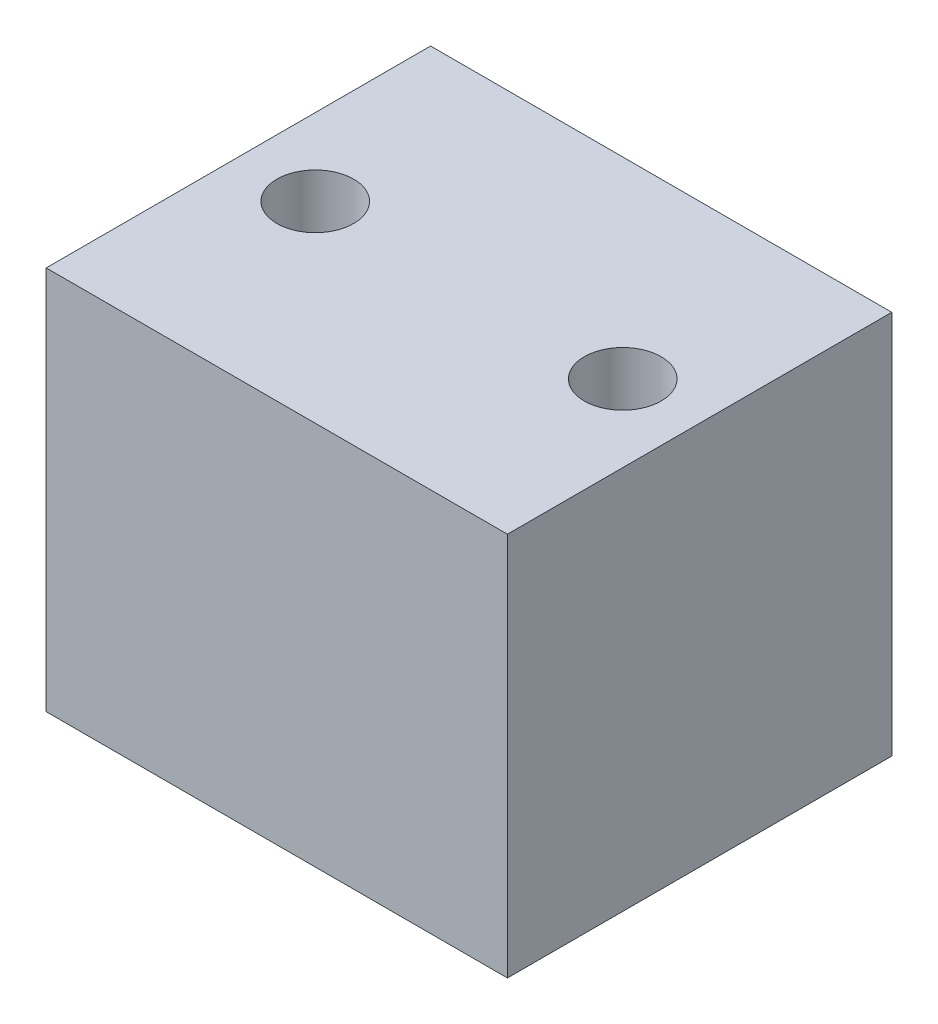
ISO-10303-21;
HEADER;
FILE_DESCRIPTION(('STEP AP214'),'2;1');
FILE_NAME('part.step','',(''),(''),'','','');
FILE_SCHEMA(('AUTOMOTIVE_DESIGN { 1 0 10303 214 1 1 1 1 }'));
ENDSEC;
DATA;
#1=APPLICATION_CONTEXT('core data for automotive mechanical design processes');
#2=APPLICATION_PROTOCOL_DEFINITION('international standard','automotive_design',2000,#1);
#3=PRODUCT_CONTEXT('',#1,'mechanical');
#4=PRODUCT('Part','Part','',(#3));
#5=PRODUCT_RELATED_PRODUCT_CATEGORY('part','',(#4));
#6=PRODUCT_DEFINITION_FORMATION('','',#4);
#7=PRODUCT_DEFINITION_CONTEXT('part definition',#1,'design');
#8=PRODUCT_DEFINITION('design','',#6,#7);
#9=PRODUCT_DEFINITION_SHAPE('','',#8);
#10=(LENGTH_UNIT() NAMED_UNIT(*) SI_UNIT(.MILLI.,.METRE.));
#11=(NAMED_UNIT(*) PLANE_ANGLE_UNIT() SI_UNIT($,.RADIAN.));
#12=(NAMED_UNIT(*) SI_UNIT($,.STERADIAN.) SOLID_ANGLE_UNIT());
#13=UNCERTAINTY_MEASURE_WITH_UNIT(LENGTH_MEASURE(1.E-05),#10,'distance_accuracy_value','');
#14=(GEOMETRIC_REPRESENTATION_CONTEXT(3) GLOBAL_UNCERTAINTY_ASSIGNED_CONTEXT((#13)) GLOBAL_UNIT_ASSIGNED_CONTEXT((#10,
#11,#12)) REPRESENTATION_CONTEXT('',''));
#15=CARTESIAN_POINT('',(0.,0.,0.));
#16=DIRECTION('',(0.,0.,1.));
#17=DIRECTION('',(1.,0.,0.));
#18=AXIS2_PLACEMENT_3D('',#15,#16,#17);
#19=CARTESIAN_POINT('',(15.,25.,0.));
#20=DIRECTION('',(1.,0.,0.));
#21=DIRECTION('',(0.,0.,-1.));
#22=AXIS2_PLACEMENT_3D('',#19,#20,#21);
#23=PLANE('',#22);
#24=DIRECTION('',(0.,0.,1.));
#25=VECTOR('',#24,1.);
#26=CARTESIAN_POINT('',(15.,0.,0.));
#27=LINE('',#26,#25);
#28=CARTESIAN_POINT('',(15.,0.,-12.5));
#29=VERTEX_POINT('',#28);
#30=CARTESIAN_POINT('',(15.,0.,12.5));
#31=VERTEX_POINT('',#30);
#32=EDGE_CURVE('E111',#29,#31,#27,.T.);
#33=ORIENTED_EDGE('',*,*,#32,.F.);
#34=DIRECTION('',(0.,-1.,0.));
#35=VECTOR('',#34,1.);
#36=CARTESIAN_POINT('',(15.,25.,-12.5));
#37=LINE('',#36,#35);
#38=CARTESIAN_POINT('',(15.,25.,-12.5));
#39=VERTEX_POINT('',#38);
#40=EDGE_CURVE('E11',#39,#29,#37,.T.);
#41=ORIENTED_EDGE('',*,*,#40,.F.);
#42=DIRECTION('',(0.,0.,1.));
#43=VECTOR('',#42,1.);
#44=CARTESIAN_POINT('',(15.,25.,0.));
#45=LINE('',#44,#43);
#46=CARTESIAN_POINT('',(15.,25.,12.5));
#47=VERTEX_POINT('',#46);
#48=EDGE_CURVE('E98',#39,#47,#45,.T.);
#49=ORIENTED_EDGE('',*,*,#48,.T.);
#50=DIRECTION('',(0.,-1.,0.));
#51=VECTOR('',#50,1.);
#52=CARTESIAN_POINT('',(15.,25.,12.5));
#53=LINE('',#52,#51);
#54=EDGE_CURVE('E77',#47,#31,#53,.T.);
#55=ORIENTED_EDGE('',*,*,#54,.T.);
#56=EDGE_LOOP('',(#33,#41,#49,#55));
#57=FACE_BOUND('',#56,.T.);
#58=ADVANCED_FACE('F37',(#57),#23,.T.);
#59=CARTESIAN_POINT('',(0.,25.,-12.5));
#60=DIRECTION('',(0.,0.,-1.));
#61=DIRECTION('',(-1.,0.,0.));
#62=AXIS2_PLACEMENT_3D('',#59,#60,#61);
#63=PLANE('',#62);
#64=DIRECTION('',(1.,0.,0.));
#65=VECTOR('',#64,1.);
#66=CARTESIAN_POINT('',(0.,0.,-12.5));
#67=LINE('',#66,#65);
#68=CARTESIAN_POINT('',(-15.,0.,-12.5));
#69=VERTEX_POINT('',#68);
#70=EDGE_CURVE('E89',#69,#29,#67,.T.);
#71=ORIENTED_EDGE('',*,*,#70,.F.);
#72=DIRECTION('',(0.,-1.,0.));
#73=VECTOR('',#72,1.);
#74=CARTESIAN_POINT('',(-15.,25.,-12.5));
#75=LINE('',#74,#73);
#76=CARTESIAN_POINT('',(-15.,25.,-12.5));
#77=VERTEX_POINT('',#76);
#78=EDGE_CURVE('E46',#77,#69,#75,.T.);
#79=ORIENTED_EDGE('',*,*,#78,.F.);
#80=DIRECTION('',(1.,0.,0.));
#81=VECTOR('',#80,1.);
#82=CARTESIAN_POINT('',(0.,25.,-12.5));
#83=LINE('',#82,#81);
#84=EDGE_CURVE('E87',#77,#39,#83,.T.);
#85=ORIENTED_EDGE('',*,*,#84,.T.);
#86=ORIENTED_EDGE('',*,*,#40,.T.);
#87=EDGE_LOOP('',(#71,#79,#85,#86));
#88=FACE_BOUND('',#87,.T.);
#89=ADVANCED_FACE('F85',(#88),#63,.T.);
#90=CARTESIAN_POINT('',(-15.,25.,0.));
#91=DIRECTION('',(1.,0.,0.));
#92=DIRECTION('',(0.,0.,-1.));
#93=AXIS2_PLACEMENT_3D('',#90,#91,#92);
#94=PLANE('',#93);
#95=DIRECTION('',(0.,0.,1.));
#96=VECTOR('',#95,1.);
#97=CARTESIAN_POINT('',(-15.,0.,0.));
#98=LINE('',#97,#96);
#99=CARTESIAN_POINT('',(-15.,0.,12.5));
#100=VERTEX_POINT('',#99);
#101=EDGE_CURVE('E114',#69,#100,#98,.T.);
#102=ORIENTED_EDGE('',*,*,#101,.T.);
#103=DIRECTION('',(0.,-1.,0.));
#104=VECTOR('',#103,1.);
#105=CARTESIAN_POINT('',(-15.,25.,12.5));
#106=LINE('',#105,#104);
#107=CARTESIAN_POINT('',(-15.,25.,12.5));
#108=VERTEX_POINT('',#107);
#109=EDGE_CURVE('E92',#108,#100,#106,.T.);
#110=ORIENTED_EDGE('',*,*,#109,.F.);
#111=DIRECTION('',(0.,0.,1.));
#112=VECTOR('',#111,1.);
#113=CARTESIAN_POINT('',(-15.,25.,0.));
#114=LINE('',#113,#112);
#115=EDGE_CURVE('E94',#77,#108,#114,.T.);
#116=ORIENTED_EDGE('',*,*,#115,.F.);
#117=ORIENTED_EDGE('',*,*,#78,.T.);
#118=EDGE_LOOP('',(#102,#110,#116,#117));
#119=FACE_BOUND('',#118,.T.);
#120=ADVANCED_FACE('F95',(#119),#94,.F.);
#121=CARTESIAN_POINT('',(-10.,25.,0.));
#122=DIRECTION('',(0.,-1.,0.));
#123=DIRECTION('',(0.,0.,-1.));
#124=AXIS2_PLACEMENT_3D('',#121,#122,#123);
#125=CYLINDRICAL_SURFACE('',#124,2.5);
#126=CARTESIAN_POINT('',(-10.,25.,0.));
#127=DIRECTION('',(0.,1.,0.));
#128=DIRECTION('',(0.,0.,1.));
#129=AXIS2_PLACEMENT_3D('',#126,#127,#128);
#130=CIRCLE('',#129,2.5);
#131=CARTESIAN_POINT('',(-10.,25.,2.5));
#132=VERTEX_POINT('',#131);
#133=EDGE_CURVE('E100',#132,#132,#130,.T.);
#134=ORIENTED_EDGE('',*,*,#133,.T.);
#135=EDGE_LOOP('',(#134));
#136=FACE_BOUND('',#135,.T.);
#137=CARTESIAN_POINT('',(-10.,0.,0.));
#138=DIRECTION('',(0.,1.,0.));
#139=DIRECTION('',(0.,0.,1.));
#140=AXIS2_PLACEMENT_3D('',#137,#138,#139);
#141=CIRCLE('',#140,2.5);
#142=CARTESIAN_POINT('',(-10.,0.,2.5));
#143=VERTEX_POINT('',#142);
#144=EDGE_CURVE('E108',#143,#143,#141,.T.);
#145=ORIENTED_EDGE('',*,*,#144,.F.);
#146=EDGE_LOOP('',(#145));
#147=FACE_BOUND('',#146,.T.);
#148=ADVANCED_FACE('F129',(#136,#147),#125,.F.);
#149=CARTESIAN_POINT('',(10.,25.,0.));
#150=DIRECTION('',(0.,-1.,0.));
#151=DIRECTION('',(0.,0.,-1.));
#152=AXIS2_PLACEMENT_3D('',#149,#150,#151);
#153=CYLINDRICAL_SURFACE('',#152,2.5);
#154=CARTESIAN_POINT('',(10.,25.,0.));
#155=DIRECTION('',(0.,1.,0.));
#156=DIRECTION('',(0.,0.,1.));
#157=AXIS2_PLACEMENT_3D('',#154,#155,#156);
#158=CIRCLE('',#157,2.5);
#159=CARTESIAN_POINT('',(10.,25.,2.5));
#160=VERTEX_POINT('',#159);
#161=EDGE_CURVE('E117',#160,#160,#158,.T.);
#162=ORIENTED_EDGE('',*,*,#161,.T.);
#163=EDGE_LOOP('',(#162));
#164=FACE_BOUND('',#163,.T.);
#165=CARTESIAN_POINT('',(10.,0.,0.));
#166=DIRECTION('',(0.,1.,0.));
#167=DIRECTION('',(0.,0.,1.));
#168=AXIS2_PLACEMENT_3D('',#165,#166,#167);
#169=CIRCLE('',#168,2.5);
#170=CARTESIAN_POINT('',(10.,0.,2.5));
#171=VERTEX_POINT('',#170);
#172=EDGE_CURVE('E105',#171,#171,#169,.T.);
#173=ORIENTED_EDGE('',*,*,#172,.F.);
#174=EDGE_LOOP('',(#173));
#175=FACE_BOUND('',#174,.T.);
#176=ADVANCED_FACE('F39',(#164,#175),#153,.F.);
#177=CARTESIAN_POINT('',(0.,25.,12.5));
#178=DIRECTION('',(0.,0.,-1.));
#179=DIRECTION('',(-1.,0.,0.));
#180=AXIS2_PLACEMENT_3D('',#177,#178,#179);
#181=PLANE('',#180);
#182=DIRECTION('',(1.,0.,0.));
#183=VECTOR('',#182,1.);
#184=CARTESIAN_POINT('',(0.,0.,12.5));
#185=LINE('',#184,#183);
#186=EDGE_CURVE('E70',#100,#31,#185,.T.);
#187=ORIENTED_EDGE('',*,*,#186,.T.);
#188=ORIENTED_EDGE('',*,*,#54,.F.);
#189=DIRECTION('',(1.,0.,0.));
#190=VECTOR('',#189,1.);
#191=CARTESIAN_POINT('',(0.,25.,12.5));
#192=LINE('',#191,#190);
#193=EDGE_CURVE('E54',#108,#47,#192,.T.);
#194=ORIENTED_EDGE('',*,*,#193,.F.);
#195=ORIENTED_EDGE('',*,*,#109,.T.);
#196=EDGE_LOOP('',(#187,#188,#194,#195));
#197=FACE_BOUND('',#196,.T.);
#198=ADVANCED_FACE('F120',(#197),#181,.F.);
#199=CARTESIAN_POINT('',(0.,25.,0.));
#200=DIRECTION('',(0.,1.,0.));
#201=DIRECTION('',(0.,0.,1.));
#202=AXIS2_PLACEMENT_3D('',#199,#200,#201);
#203=PLANE('',#202);
#204=ORIENTED_EDGE('',*,*,#161,.F.);
#205=EDGE_LOOP('',(#204));
#206=FACE_BOUND('',#205,.T.);
#207=ORIENTED_EDGE('',*,*,#133,.F.);
#208=EDGE_LOOP('',(#207));
#209=FACE_BOUND('',#208,.T.);
#210=ORIENTED_EDGE('',*,*,#48,.F.);
#211=ORIENTED_EDGE('',*,*,#84,.F.);
#212=ORIENTED_EDGE('',*,*,#115,.T.);
#213=ORIENTED_EDGE('',*,*,#193,.T.);
#214=EDGE_LOOP('',(#210,#211,#212,#213));
#215=FACE_BOUND('',#214,.T.);
#216=ADVANCED_FACE('F97',(#206,#209,#215),#203,.T.);
#217=CARTESIAN_POINT('',(0.,0.,0.));
#218=DIRECTION('',(0.,1.,0.));
#219=DIRECTION('',(0.,0.,1.));
#220=AXIS2_PLACEMENT_3D('',#217,#218,#219);
#221=PLANE('',#220);
#222=ORIENTED_EDGE('',*,*,#172,.T.);
#223=EDGE_LOOP('',(#222));
#224=FACE_BOUND('',#223,.T.);
#225=ORIENTED_EDGE('',*,*,#144,.T.);
#226=EDGE_LOOP('',(#225));
#227=FACE_BOUND('',#226,.T.);
#228=ORIENTED_EDGE('',*,*,#32,.T.);
#229=ORIENTED_EDGE('',*,*,#186,.F.);
#230=ORIENTED_EDGE('',*,*,#101,.F.);
#231=ORIENTED_EDGE('',*,*,#70,.T.);
#232=EDGE_LOOP('',(#228,#229,#230,#231));
#233=FACE_BOUND('',#232,.T.);
#234=ADVANCED_FACE('F121',(#224,#227,#233),#221,.F.);
#235=CLOSED_SHELL('',(#58,#89,#120,#148,#176,#198,#216,#234));
#236=MANIFOLD_SOLID_BREP('B2',#235);
#237=ADVANCED_BREP_SHAPE_REPRESENTATION('',(#18,#236),#14);
#238=SHAPE_DEFINITION_REPRESENTATION(#9,#237);
ENDSEC;
END-ISO-10303-21;
